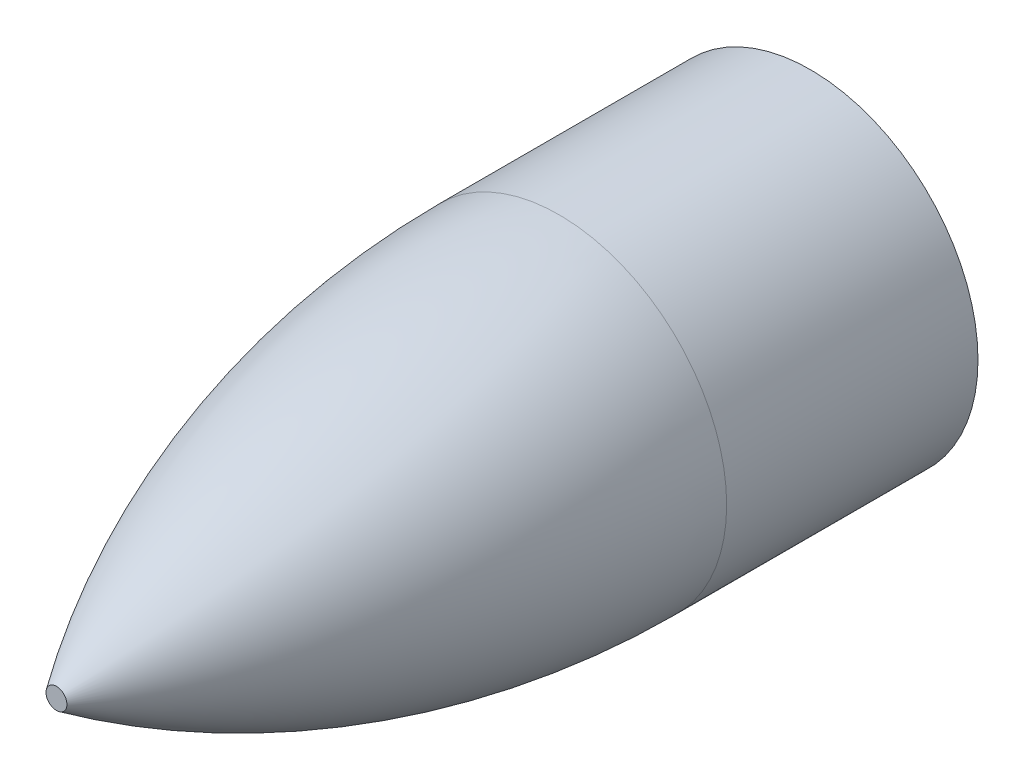
ISO-10303-21;
HEADER;
FILE_DESCRIPTION(('STEP AP214'),'2;1');
FILE_NAME('part.step','',(''),(''),'','','');
FILE_SCHEMA(('AUTOMOTIVE_DESIGN { 1 0 10303 214 1 1 1 1 }'));
ENDSEC;
DATA;
#1=APPLICATION_CONTEXT('core data for automotive mechanical design processes');
#2=APPLICATION_PROTOCOL_DEFINITION('international standard','automotive_design',2000,#1);
#3=PRODUCT_CONTEXT('',#1,'mechanical');
#4=PRODUCT('Part','Part','',(#3));
#5=PRODUCT_RELATED_PRODUCT_CATEGORY('part','',(#4));
#6=PRODUCT_DEFINITION_FORMATION('','',#4);
#7=PRODUCT_DEFINITION_CONTEXT('part definition',#1,'design');
#8=PRODUCT_DEFINITION('design','',#6,#7);
#9=PRODUCT_DEFINITION_SHAPE('','',#8);
#10=(LENGTH_UNIT() NAMED_UNIT(*) SI_UNIT(.MILLI.,.METRE.));
#11=(NAMED_UNIT(*) PLANE_ANGLE_UNIT() SI_UNIT($,.RADIAN.));
#12=(NAMED_UNIT(*) SI_UNIT($,.STERADIAN.) SOLID_ANGLE_UNIT());
#13=UNCERTAINTY_MEASURE_WITH_UNIT(LENGTH_MEASURE(1.E-05),#10,'distance_accuracy_value','');
#14=(GEOMETRIC_REPRESENTATION_CONTEXT(3) GLOBAL_UNCERTAINTY_ASSIGNED_CONTEXT((#13)) GLOBAL_UNIT_ASSIGNED_CONTEXT((#10,
#11,#12)) REPRESENTATION_CONTEXT('',''));
#15=CARTESIAN_POINT('',(0.,0.,0.));
#16=DIRECTION('',(0.,0.,1.));
#17=DIRECTION('',(1.,0.,0.));
#18=AXIS2_PLACEMENT_3D('',#15,#16,#17);
#19=CARTESIAN_POINT('',(0.,0.,-47.625));
#20=DIRECTION('',(0.,0.,-1.));
#21=DIRECTION('',(-1.,0.,0.));
#22=AXIS2_PLACEMENT_3D('',#19,#20,#21);
#23=CYLINDRICAL_SURFACE('',#22,11.2395);
#24=CARTESIAN_POINT('',(0.,0.,-47.625));
#25=DIRECTION('',(0.,0.,-1.));
#26=DIRECTION('',(-1.,0.,0.));
#27=AXIS2_PLACEMENT_3D('',#24,#25,#26);
#28=CIRCLE('',#27,11.2395);
#29=CARTESIAN_POINT('',(-11.2395,0.,-47.625));
#30=VERTEX_POINT('',#29);
#31=EDGE_CURVE('E176',#30,#30,#28,.T.);
#32=ORIENTED_EDGE('',*,*,#31,.F.);
#33=EDGE_LOOP('',(#32));
#34=FACE_BOUND('',#33,.T.);
#35=DIRECTION('',(0.,0.,-1.));
#36=VECTOR('',#35,1.);
#37=CARTESIAN_POINT('',(1.4605,-11.144204771988,-47.625));
#38=LINE('',#37,#36);
#39=CARTESIAN_POINT('',(1.4605,-11.144204771988,-54.229));
#40=VERTEX_POINT('',#39);
#41=CARTESIAN_POINT('',(1.4605,-11.144204771988,-57.15));
#42=VERTEX_POINT('',#41);
#43=EDGE_CURVE('E11',#40,#42,#38,.T.);
#44=ORIENTED_EDGE('',*,*,#43,.F.);
#45=CARTESIAN_POINT('',(0.,0.,-54.229));
#46=DIRECTION('',(0.,0.,-1.));
#47=DIRECTION('',(-1.,0.,0.));
#48=AXIS2_PLACEMENT_3D('',#45,#46,#47);
#49=CIRCLE('',#48,11.2395);
#50=CARTESIAN_POINT('',(-1.4605,-11.144204771988,-54.229));
#51=VERTEX_POINT('',#50);
#52=EDGE_CURVE('E57',#51,#40,#49,.F.);
#53=ORIENTED_EDGE('',*,*,#52,.F.);
#54=DIRECTION('',(0.,0.,-1.));
#55=VECTOR('',#54,1.);
#56=CARTESIAN_POINT('',(-1.4605,-11.144204771988,-47.625));
#57=LINE('',#56,#55);
#58=CARTESIAN_POINT('',(-1.4605,-11.144204771988,-57.15));
#59=VERTEX_POINT('',#58);
#60=EDGE_CURVE('E50',#59,#51,#57,.F.);
#61=ORIENTED_EDGE('',*,*,#60,.F.);
#62=CARTESIAN_POINT('',(0.,0.,-57.15));
#63=DIRECTION('',(0.,0.,-1.));
#64=DIRECTION('',(-1.,0.,0.));
#65=AXIS2_PLACEMENT_3D('',#62,#63,#64);
#66=CIRCLE('',#65,11.2395);
#67=CARTESIAN_POINT('',(-1.4605,11.144204771988,-57.15));
#68=VERTEX_POINT('',#67);
#69=EDGE_CURVE('E164',#59,#68,#66,.T.);
#70=ORIENTED_EDGE('',*,*,#69,.T.);
#71=DIRECTION('',(0.,0.,-1.));
#72=VECTOR('',#71,1.);
#73=CARTESIAN_POINT('',(-1.4605,11.144204771988,-47.625));
#74=LINE('',#73,#72);
#75=CARTESIAN_POINT('',(-1.4605,11.144204771988,-54.229));
#76=VERTEX_POINT('',#75);
#77=EDGE_CURVE('E199',#68,#76,#74,.F.);
#78=ORIENTED_EDGE('',*,*,#77,.T.);
#79=CARTESIAN_POINT('',(0.,0.,-54.229));
#80=DIRECTION('',(0.,0.,1.));
#81=DIRECTION('',(1.,0.,0.));
#82=AXIS2_PLACEMENT_3D('',#79,#80,#81);
#83=CIRCLE('',#82,11.2395);
#84=CARTESIAN_POINT('',(1.4605,11.144204771988,-54.229));
#85=VERTEX_POINT('',#84);
#86=EDGE_CURVE('E202',#76,#85,#83,.F.);
#87=ORIENTED_EDGE('',*,*,#86,.T.);
#88=DIRECTION('',(0.,0.,-1.));
#89=VECTOR('',#88,1.);
#90=CARTESIAN_POINT('',(1.4605,11.144204771988,-47.625));
#91=LINE('',#90,#89);
#92=CARTESIAN_POINT('',(1.4605,11.144204771988,-57.15));
#93=VERTEX_POINT('',#92);
#94=EDGE_CURVE('E205',#85,#93,#91,.T.);
#95=ORIENTED_EDGE('',*,*,#94,.T.);
#96=EDGE_CURVE('E181',#93,#42,#66,.T.);
#97=ORIENTED_EDGE('',*,*,#96,.T.);
#98=EDGE_LOOP('',(#44,#53,#61,#70,#78,#87,#95,#97));
#99=FACE_BOUND('',#98,.T.);
#100=ADVANCED_FACE('F41',(#34,#99),#23,.F.);
#101=CARTESIAN_POINT('',(0.,0.,-57.15));
#102=DIRECTION('',(0.,0.,-1.));
#103=DIRECTION('',(-1.,0.,0.));
#104=AXIS2_PLACEMENT_3D('',#101,#102,#103);
#105=PLANE('',#104);
#106=DIRECTION('',(0.,-1.,0.));
#107=VECTOR('',#106,1.);
#108=CARTESIAN_POINT('',(1.4605,-9.5885,-57.15));
#109=LINE('',#108,#107);
#110=CARTESIAN_POINT('',(1.4605,-9.5885,-57.15));
#111=VERTEX_POINT('',#110);
#112=EDGE_CURVE('E127',#111,#42,#109,.T.);
#113=ORIENTED_EDGE('',*,*,#112,.T.);
#114=ORIENTED_EDGE('',*,*,#96,.F.);
#115=DIRECTION('',(0.,1.,0.));
#116=VECTOR('',#115,1.);
#117=CARTESIAN_POINT('',(1.4605,9.5885,-57.15));
#118=LINE('',#117,#116);
#119=CARTESIAN_POINT('',(1.4605,9.5885,-57.15));
#120=VERTEX_POINT('',#119);
#121=EDGE_CURVE('E159',#120,#93,#118,.T.);
#122=ORIENTED_EDGE('',*,*,#121,.F.);
#123=DIRECTION('',(-1.,0.,0.));
#124=VECTOR('',#123,1.);
#125=CARTESIAN_POINT('',(1.4605,9.5885,-57.15));
#126=LINE('',#125,#124);
#127=CARTESIAN_POINT('',(-1.4605,9.5885,-57.15));
#128=VERTEX_POINT('',#127);
#129=EDGE_CURVE('E147',#120,#128,#126,.T.);
#130=ORIENTED_EDGE('',*,*,#129,.T.);
#131=DIRECTION('',(0.,1.,0.));
#132=VECTOR('',#131,1.);
#133=CARTESIAN_POINT('',(-1.4605,9.5885,-57.15));
#134=LINE('',#133,#132);
#135=EDGE_CURVE('E169',#128,#68,#134,.T.);
#136=ORIENTED_EDGE('',*,*,#135,.T.);
#137=ORIENTED_EDGE('',*,*,#69,.F.);
#138=DIRECTION('',(0.,-1.,0.));
#139=VECTOR('',#138,1.);
#140=CARTESIAN_POINT('',(-1.4605,-9.5885,-57.15));
#141=LINE('',#140,#139);
#142=CARTESIAN_POINT('',(-1.4605,-9.5885,-57.15));
#143=VERTEX_POINT('',#142);
#144=EDGE_CURVE('E138',#143,#59,#141,.T.);
#145=ORIENTED_EDGE('',*,*,#144,.F.);
#146=DIRECTION('',(-1.,0.,0.));
#147=VECTOR('',#146,1.);
#148=CARTESIAN_POINT('',(1.4605,-9.5885,-57.15));
#149=LINE('',#148,#147);
#150=EDGE_CURVE('E123',#111,#143,#149,.T.);
#151=ORIENTED_EDGE('',*,*,#150,.F.);
#152=EDGE_LOOP('',(#113,#114,#122,#130,#136,#137,#145,#151));
#153=FACE_BOUND('',#152,.T.);
#154=CARTESIAN_POINT('',(0.,0.,-57.15));
#155=DIRECTION('',(0.,0.,1.));
#156=DIRECTION('',(1.,0.,0.));
#157=AXIS2_PLACEMENT_3D('',#154,#155,#156);
#158=CIRCLE('',#157,12.7);
#159=CARTESIAN_POINT('',(12.7,0.,-57.15));
#160=VERTEX_POINT('',#159);
#161=EDGE_CURVE('E195',#160,#160,#158,.T.);
#162=ORIENTED_EDGE('',*,*,#161,.F.);
#163=EDGE_LOOP('',(#162));
#164=FACE_BOUND('',#163,.T.);
#165=ADVANCED_FACE('F215',(#153,#164),#105,.T.);
#166=CARTESIAN_POINT('',(0.,0.,0.));
#167=DIRECTION('',(0.,0.,1.));
#168=DIRECTION('',(1.,0.,0.));
#169=AXIS2_PLACEMENT_3D('',#166,#167,#168);
#170=CYLINDRICAL_SURFACE('',#169,12.7);
#171=ORIENTED_EDGE('',*,*,#161,.T.);
#172=EDGE_LOOP('',(#171));
#173=FACE_BOUND('',#172,.T.);
#174=CARTESIAN_POINT('',(0.,0.,-38.1));
#175=DIRECTION('',(0.,0.,1.));
#176=DIRECTION('',(1.,0.,0.));
#177=AXIS2_PLACEMENT_3D('',#174,#175,#176);
#178=CIRCLE('',#177,12.7);
#179=CARTESIAN_POINT('',(12.7,0.,-38.1));
#180=VERTEX_POINT('',#179);
#181=EDGE_CURVE('E191',#180,#180,#178,.T.);
#182=ORIENTED_EDGE('',*,*,#181,.F.);
#183=EDGE_LOOP('',(#182));
#184=FACE_BOUND('',#183,.T.);
#185=ADVANCED_FACE('F248',(#173,#184),#170,.T.);
#186=CARTESIAN_POINT('',(0.,0.,-38.1));
#187=DIRECTION('',(0.,0.,1.));
#188=DIRECTION('',(1.,0.,0.));
#189=AXIS2_PLACEMENT_3D('',#186,#187,#188);
#190=DEGENERATE_TOROIDAL_SURFACE('',#189,54.213125,66.913125,.F.);
#191=ORIENTED_EDGE('',*,*,#181,.T.);
#192=EDGE_LOOP('',(#191));
#193=FACE_BOUND('',#192,.T.);
#194=CARTESIAN_POINT('',(0.,0.,0.));
#195=DIRECTION('',(0.,0.,1.));
#196=DIRECTION('',(1.,0.,0.));
#197=AXIS2_PLACEMENT_3D('',#194,#195,#196);
#198=CIRCLE('',#197,0.79375);
#199=CARTESIAN_POINT('',(0.79375,0.,0.));
#200=VERTEX_POINT('',#199);
#201=EDGE_CURVE('E187',#200,#200,#198,.T.);
#202=ORIENTED_EDGE('',*,*,#201,.F.);
#203=EDGE_LOOP('',(#202));
#204=FACE_BOUND('',#203,.T.);
#205=ADVANCED_FACE('F257',(#193,#204),#190,.F.);
#206=CARTESIAN_POINT('',(0.,0.,0.));
#207=DIRECTION('',(0.,0.,1.));
#208=DIRECTION('',(1.,0.,0.));
#209=AXIS2_PLACEMENT_3D('',#206,#207,#208);
#210=PLANE('',#209);
#211=ORIENTED_EDGE('',*,*,#201,.T.);
#212=EDGE_LOOP('',(#211));
#213=FACE_BOUND('',#212,.T.);
#214=ADVANCED_FACE('F254',(#213),#210,.T.);
#215=CARTESIAN_POINT('',(0.,0.,-47.625));
#216=DIRECTION('',(0.,0.,-1.));
#217=DIRECTION('',(-1.,0.,0.));
#218=AXIS2_PLACEMENT_3D('',#215,#216,#217);
#219=PLANE('',#218);
#220=ORIENTED_EDGE('',*,*,#31,.T.);
#221=EDGE_LOOP('',(#220));
#222=FACE_BOUND('',#221,.T.);
#223=CARTESIAN_POINT('',(0.,0.,-47.625));
#224=DIRECTION('',(0.,0.,-1.));
#225=DIRECTION('',(-1.,0.,0.));
#226=AXIS2_PLACEMENT_3D('',#223,#224,#225);
#227=CIRCLE('',#226,9.525);
#228=CARTESIAN_POINT('',(-9.525,0.,-47.625));
#229=VERTEX_POINT('',#228);
#230=EDGE_CURVE('E180',#229,#229,#227,.F.);
#231=ORIENTED_EDGE('',*,*,#230,.T.);
#232=EDGE_LOOP('',(#231));
#233=FACE_BOUND('',#232,.T.);
#234=ADVANCED_FACE('F252',(#222,#233),#219,.T.);
#235=CARTESIAN_POINT('',(0.,0.,-47.625));
#236=DIRECTION('',(0.,0.,1.));
#237=DIRECTION('',(0.,1.,0.));
#238=AXIS2_PLACEMENT_3D('',#235,#236,#237);
#239=SPHERICAL_SURFACE('',#238,9.52499999999999);
#240=ORIENTED_EDGE('',*,*,#230,.F.);
#241=EDGE_LOOP('',(#240));
#242=FACE_BOUND('',#241,.T.);
#243=ADVANCED_FACE('F43',(#242),#239,.F.);
#244=CARTESIAN_POINT('',(1.4605,9.5885,-57.15));
#245=DIRECTION('',(1.,0.,0.));
#246=DIRECTION('',(0.,0.,-1.));
#247=AXIS2_PLACEMENT_3D('',#244,#245,#246);
#248=PLANE('',#247);
#249=ORIENTED_EDGE('',*,*,#94,.F.);
#250=DIRECTION('',(0.,1.,0.));
#251=VECTOR('',#250,1.);
#252=CARTESIAN_POINT('',(1.4605,9.5885,-54.229));
#253=LINE('',#252,#251);
#254=CARTESIAN_POINT('',(1.4605,9.5885,-54.229));
#255=VERTEX_POINT('',#254);
#256=EDGE_CURVE('E160',#255,#85,#253,.T.);
#257=ORIENTED_EDGE('',*,*,#256,.F.);
#258=DIRECTION('',(0.,0.,-1.));
#259=VECTOR('',#258,1.);
#260=CARTESIAN_POINT('',(1.4605,9.5885,-57.15));
#261=LINE('',#260,#259);
#262=EDGE_CURVE('E137',#255,#120,#261,.T.);
#263=ORIENTED_EDGE('',*,*,#262,.T.);
#264=ORIENTED_EDGE('',*,*,#121,.T.);
#265=EDGE_LOOP('',(#249,#257,#263,#264));
#266=FACE_BOUND('',#265,.T.);
#267=ADVANCED_FACE('F228',(#266),#248,.T.);
#268=CARTESIAN_POINT('',(1.4605,9.5885,-54.229));
#269=DIRECTION('',(0.,0.,1.));
#270=DIRECTION('',(1.,0.,0.));
#271=AXIS2_PLACEMENT_3D('',#268,#269,#270);
#272=PLANE('',#271);
#273=ORIENTED_EDGE('',*,*,#86,.F.);
#274=DIRECTION('',(0.,1.,0.));
#275=VECTOR('',#274,1.);
#276=CARTESIAN_POINT('',(-1.4605,9.5885,-54.229));
#277=LINE('',#276,#275);
#278=CARTESIAN_POINT('',(-1.4605,9.5885,-54.229));
#279=VERTEX_POINT('',#278);
#280=EDGE_CURVE('E165',#279,#76,#277,.T.);
#281=ORIENTED_EDGE('',*,*,#280,.F.);
#282=DIRECTION('',(1.,0.,0.));
#283=VECTOR('',#282,1.);
#284=CARTESIAN_POINT('',(1.4605,9.5885,-54.229));
#285=LINE('',#284,#283);
#286=EDGE_CURVE('E155',#279,#255,#285,.T.);
#287=ORIENTED_EDGE('',*,*,#286,.T.);
#288=ORIENTED_EDGE('',*,*,#256,.T.);
#289=EDGE_LOOP('',(#273,#281,#287,#288));
#290=FACE_BOUND('',#289,.T.);
#291=ADVANCED_FACE('F225',(#290),#272,.T.);
#292=CARTESIAN_POINT('',(-1.4605,9.5885,-57.15));
#293=DIRECTION('',(-1.,0.,0.));
#294=DIRECTION('',(0.,0.,1.));
#295=AXIS2_PLACEMENT_3D('',#292,#293,#294);
#296=PLANE('',#295);
#297=ORIENTED_EDGE('',*,*,#77,.F.);
#298=ORIENTED_EDGE('',*,*,#135,.F.);
#299=DIRECTION('',(0.,0.,1.));
#300=VECTOR('',#299,1.);
#301=CARTESIAN_POINT('',(-1.4605,9.5885,-57.15));
#302=LINE('',#301,#300);
#303=EDGE_CURVE('E151',#128,#279,#302,.T.);
#304=ORIENTED_EDGE('',*,*,#303,.T.);
#305=ORIENTED_EDGE('',*,*,#280,.T.);
#306=EDGE_LOOP('',(#297,#298,#304,#305));
#307=FACE_BOUND('',#306,.T.);
#308=ADVANCED_FACE('F221',(#307),#296,.T.);
#309=CARTESIAN_POINT('',(0.,9.5885,0.));
#310=DIRECTION('',(0.,-1.,0.));
#311=DIRECTION('',(0.,0.,-1.));
#312=AXIS2_PLACEMENT_3D('',#309,#310,#311);
#313=PLANE('',#312);
#314=ORIENTED_EDGE('',*,*,#262,.F.);
#315=ORIENTED_EDGE('',*,*,#286,.F.);
#316=ORIENTED_EDGE('',*,*,#303,.F.);
#317=ORIENTED_EDGE('',*,*,#129,.F.);
#318=EDGE_LOOP('',(#314,#315,#316,#317));
#319=FACE_BOUND('',#318,.T.);
#320=ADVANCED_FACE('F232',(#319),#313,.T.);
#321=CARTESIAN_POINT('',(1.4605,-9.5885,-57.15));
#322=DIRECTION('',(-1.,0.,0.));
#323=DIRECTION('',(0.,0.,1.));
#324=AXIS2_PLACEMENT_3D('',#321,#322,#323);
#325=PLANE('',#324);
#326=DIRECTION('',(0.,-1.,0.));
#327=VECTOR('',#326,1.);
#328=CARTESIAN_POINT('',(1.4605,-9.5885,-54.229));
#329=LINE('',#328,#327);
#330=CARTESIAN_POINT('',(1.4605,-9.5885,-54.229));
#331=VERTEX_POINT('',#330);
#332=EDGE_CURVE('E118',#331,#40,#329,.T.);
#333=ORIENTED_EDGE('',*,*,#332,.T.);
#334=ORIENTED_EDGE('',*,*,#43,.T.);
#335=ORIENTED_EDGE('',*,*,#112,.F.);
#336=DIRECTION('',(0.,0.,-1.));
#337=VECTOR('',#336,1.);
#338=CARTESIAN_POINT('',(1.4605,-9.5885,-57.15));
#339=LINE('',#338,#337);
#340=EDGE_CURVE('E108',#331,#111,#339,.T.);
#341=ORIENTED_EDGE('',*,*,#340,.F.);
#342=EDGE_LOOP('',(#333,#334,#335,#341));
#343=FACE_BOUND('',#342,.T.);
#344=ADVANCED_FACE('F125',(#343),#325,.F.);
#345=CARTESIAN_POINT('',(-1.4605,-9.5885,-57.15));
#346=DIRECTION('',(1.,0.,0.));
#347=DIRECTION('',(0.,0.,-1.));
#348=AXIS2_PLACEMENT_3D('',#345,#346,#347);
#349=PLANE('',#348);
#350=ORIENTED_EDGE('',*,*,#144,.T.);
#351=ORIENTED_EDGE('',*,*,#60,.T.);
#352=DIRECTION('',(0.,-1.,0.));
#353=VECTOR('',#352,1.);
#354=CARTESIAN_POINT('',(-1.4605,-9.5885,-54.229));
#355=LINE('',#354,#353);
#356=CARTESIAN_POINT('',(-1.4605,-9.5885,-54.229));
#357=VERTEX_POINT('',#356);
#358=EDGE_CURVE('E122',#357,#51,#355,.T.);
#359=ORIENTED_EDGE('',*,*,#358,.F.);
#360=DIRECTION('',(0.,0.,1.));
#361=VECTOR('',#360,1.);
#362=CARTESIAN_POINT('',(-1.4605,-9.5885,-57.15));
#363=LINE('',#362,#361);
#364=EDGE_CURVE('E111',#143,#357,#363,.T.);
#365=ORIENTED_EDGE('',*,*,#364,.F.);
#366=EDGE_LOOP('',(#350,#351,#359,#365));
#367=FACE_BOUND('',#366,.T.);
#368=ADVANCED_FACE('F212',(#367),#349,.F.);
#369=CARTESIAN_POINT('',(1.4605,-9.5885,-54.229));
#370=DIRECTION('',(0.,0.,-1.));
#371=DIRECTION('',(-1.,0.,0.));
#372=AXIS2_PLACEMENT_3D('',#369,#370,#371);
#373=PLANE('',#372);
#374=ORIENTED_EDGE('',*,*,#358,.T.);
#375=ORIENTED_EDGE('',*,*,#52,.T.);
#376=ORIENTED_EDGE('',*,*,#332,.F.);
#377=DIRECTION('',(1.,0.,0.));
#378=VECTOR('',#377,1.);
#379=CARTESIAN_POINT('',(1.4605,-9.5885,-54.229));
#380=LINE('',#379,#378);
#381=EDGE_CURVE('E104',#357,#331,#380,.T.);
#382=ORIENTED_EDGE('',*,*,#381,.F.);
#383=EDGE_LOOP('',(#374,#375,#376,#382));
#384=FACE_BOUND('',#383,.T.);
#385=ADVANCED_FACE('F119',(#384),#373,.F.);
#386=CARTESIAN_POINT('',(0.,-9.5885,0.));
#387=DIRECTION('',(0.,1.,0.));
#388=DIRECTION('',(0.,0.,-1.));
#389=AXIS2_PLACEMENT_3D('',#386,#387,#388);
#390=PLANE('',#389);
#391=ORIENTED_EDGE('',*,*,#340,.T.);
#392=ORIENTED_EDGE('',*,*,#150,.T.);
#393=ORIENTED_EDGE('',*,*,#364,.T.);
#394=ORIENTED_EDGE('',*,*,#381,.T.);
#395=EDGE_LOOP('',(#391,#392,#393,#394));
#396=FACE_BOUND('',#395,.T.);
#397=ADVANCED_FACE('F106',(#396),#390,.T.);
#398=CLOSED_SHELL('',(#100,#165,#185,#205,#214,#234,#243,#267,#291,#308,#320,#344,#368,#385,#397));
#399=MANIFOLD_SOLID_BREP('B2',#398);
#400=ADVANCED_BREP_SHAPE_REPRESENTATION('',(#18,#399),#14);
#401=SHAPE_DEFINITION_REPRESENTATION(#9,#400);
ENDSEC;
END-ISO-10303-21;
